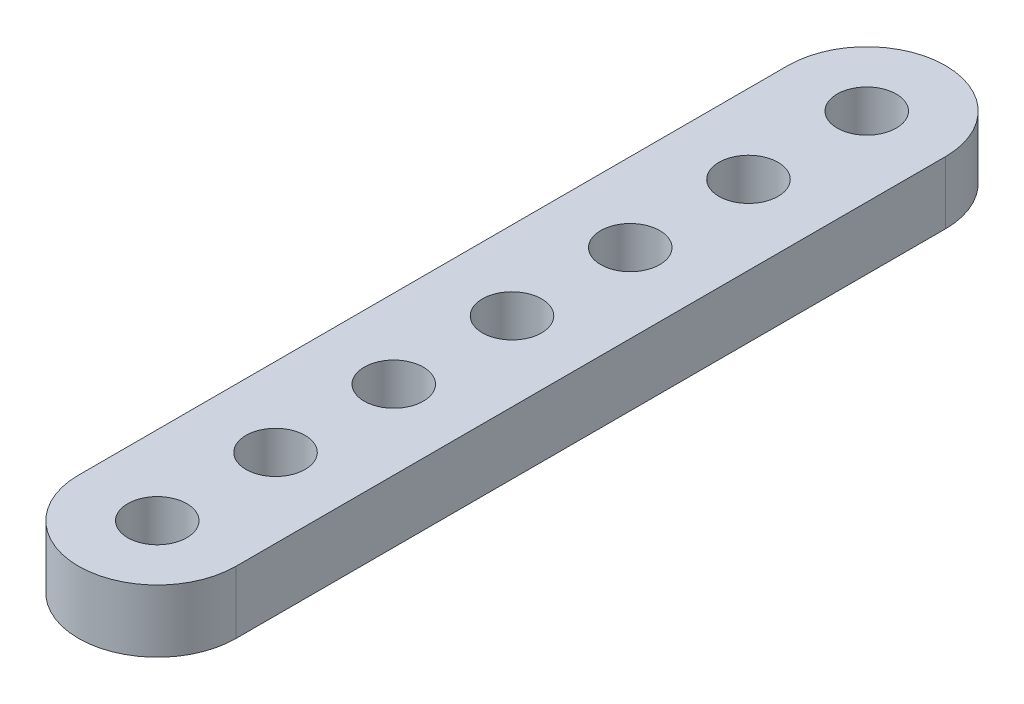
ISO-10303-21;
HEADER;
FILE_DESCRIPTION(('STEP AP214'),'2;1');
FILE_NAME('part.step','',(''),(''),'','','');
FILE_SCHEMA(('AUTOMOTIVE_DESIGN { 1 0 10303 214 1 1 1 1 }'));
ENDSEC;
DATA;
#1=APPLICATION_CONTEXT('core data for automotive mechanical design processes');
#2=APPLICATION_PROTOCOL_DEFINITION('international standard','automotive_design',2000,#1);
#3=PRODUCT_CONTEXT('',#1,'mechanical');
#4=PRODUCT('Part','Part','',(#3));
#5=PRODUCT_RELATED_PRODUCT_CATEGORY('part','',(#4));
#6=PRODUCT_DEFINITION_FORMATION('','',#4);
#7=PRODUCT_DEFINITION_CONTEXT('part definition',#1,'design');
#8=PRODUCT_DEFINITION('design','',#6,#7);
#9=PRODUCT_DEFINITION_SHAPE('','',#8);
#10=(LENGTH_UNIT() NAMED_UNIT(*) SI_UNIT(.MILLI.,.METRE.));
#11=(NAMED_UNIT(*) PLANE_ANGLE_UNIT() SI_UNIT($,.RADIAN.));
#12=(NAMED_UNIT(*) SI_UNIT($,.STERADIAN.) SOLID_ANGLE_UNIT());
#13=UNCERTAINTY_MEASURE_WITH_UNIT(LENGTH_MEASURE(1.E-05),#10,'distance_accuracy_value','');
#14=(GEOMETRIC_REPRESENTATION_CONTEXT(3) GLOBAL_UNCERTAINTY_ASSIGNED_CONTEXT((#13)) GLOBAL_UNIT_ASSIGNED_CONTEXT((#10,
#11,#12)) REPRESENTATION_CONTEXT('',''));
#15=CARTESIAN_POINT('',(0.,0.,0.));
#16=DIRECTION('',(0.,0.,1.));
#17=DIRECTION('',(1.,0.,0.));
#18=AXIS2_PLACEMENT_3D('',#15,#16,#17);
#19=CARTESIAN_POINT('',(4.,3.175,0.));
#20=DIRECTION('',(0.,1.,0.));
#21=DIRECTION('',(0.,0.,1.));
#22=AXIS2_PLACEMENT_3D('',#19,#20,#21);
#23=PLANE('',#22);
#24=CARTESIAN_POINT('',(3.9999999999999,3.175,-30.));
#25=DIRECTION('',(0.,1.,0.));
#26=DIRECTION('',(0.,0.,1.));
#27=AXIS2_PLACEMENT_3D('',#24,#25,#26);
#28=CIRCLE('',#27,1.5);
#29=CARTESIAN_POINT('',(3.9999999999999,3.175,-28.5));
#30=VERTEX_POINT('',#29);
#31=EDGE_CURVE('E141',#30,#30,#28,.T.);
#32=ORIENTED_EDGE('',*,*,#31,.F.);
#33=EDGE_LOOP('',(#32));
#34=FACE_BOUND('',#33,.T.);
#35=CARTESIAN_POINT('',(3.99999999999994,3.175,-18.));
#36=DIRECTION('',(0.,1.,0.));
#37=DIRECTION('',(0.,0.,1.));
#38=AXIS2_PLACEMENT_3D('',#35,#36,#37);
#39=CIRCLE('',#38,1.5);
#40=CARTESIAN_POINT('',(3.99999999999994,3.175,-16.5));
#41=VERTEX_POINT('',#40);
#42=EDGE_CURVE('E129',#41,#41,#39,.T.);
#43=ORIENTED_EDGE('',*,*,#42,.F.);
#44=EDGE_LOOP('',(#43));
#45=FACE_BOUND('',#44,.T.);
#46=CARTESIAN_POINT('',(3.99999999999998,3.175,-6.));
#47=DIRECTION('',(0.,1.,0.));
#48=DIRECTION('',(0.,0.,1.));
#49=AXIS2_PLACEMENT_3D('',#46,#47,#48);
#50=CIRCLE('',#49,1.5);
#51=CARTESIAN_POINT('',(3.99999999999998,3.175,-4.5));
#52=VERTEX_POINT('',#51);
#53=EDGE_CURVE('E117',#52,#52,#50,.T.);
#54=ORIENTED_EDGE('',*,*,#53,.F.);
#55=EDGE_LOOP('',(#54));
#56=FACE_BOUND('',#55,.T.);
#57=CARTESIAN_POINT('',(4.,3.175,0.));
#58=DIRECTION('',(0.,1.,0.));
#59=DIRECTION('',(0.,0.,1.));
#60=AXIS2_PLACEMENT_3D('',#57,#58,#59);
#61=CIRCLE('',#60,4.);
#62=CARTESIAN_POINT('',(0.,3.175,0.));
#63=VERTEX_POINT('',#62);
#64=CARTESIAN_POINT('',(8.,3.175,0.));
#65=VERTEX_POINT('',#64);
#66=EDGE_CURVE('E87',#63,#65,#61,.T.);
#67=ORIENTED_EDGE('',*,*,#66,.T.);
#68=DIRECTION('',(0.,0.,-1.));
#69=VECTOR('',#68,1.);
#70=CARTESIAN_POINT('',(8.,3.175,0.));
#71=LINE('',#70,#69);
#72=CARTESIAN_POINT('',(7.99999999999988,3.175,-36.));
#73=VERTEX_POINT('',#72);
#74=EDGE_CURVE('E82',#65,#73,#71,.T.);
#75=ORIENTED_EDGE('',*,*,#74,.T.);
#76=CARTESIAN_POINT('',(3.99999999999987,3.175,-36.));
#77=DIRECTION('',(0.,1.,0.));
#78=DIRECTION('',(0.,0.,1.));
#79=AXIS2_PLACEMENT_3D('',#76,#77,#78);
#80=CIRCLE('',#79,4.);
#81=CARTESIAN_POINT('',(0.,3.175,-36.));
#82=VERTEX_POINT('',#81);
#83=EDGE_CURVE('E85',#73,#82,#80,.T.);
#84=ORIENTED_EDGE('',*,*,#83,.T.);
#85=DIRECTION('',(0.,0.,1.));
#86=VECTOR('',#85,1.);
#87=CARTESIAN_POINT('',(0.,3.175,0.));
#88=LINE('',#87,#86);
#89=EDGE_CURVE('E52',#82,#63,#88,.T.);
#90=ORIENTED_EDGE('',*,*,#89,.T.);
#91=EDGE_LOOP('',(#67,#75,#84,#90));
#92=FACE_BOUND('',#91,.T.);
#93=CARTESIAN_POINT('',(4.,3.175,0.));
#94=DIRECTION('',(0.,1.,0.));
#95=DIRECTION('',(0.,0.,1.));
#96=AXIS2_PLACEMENT_3D('',#93,#94,#95);
#97=CIRCLE('',#96,1.5);
#98=CARTESIAN_POINT('',(4.,3.175,1.5));
#99=VERTEX_POINT('',#98);
#100=EDGE_CURVE('E102',#99,#99,#97,.T.);
#101=ORIENTED_EDGE('',*,*,#100,.F.);
#102=EDGE_LOOP('',(#101));
#103=FACE_BOUND('',#102,.T.);
#104=CARTESIAN_POINT('',(3.99999999999996,3.175,-12.));
#105=DIRECTION('',(0.,1.,0.));
#106=DIRECTION('',(0.,0.,1.));
#107=AXIS2_PLACEMENT_3D('',#104,#105,#106);
#108=CIRCLE('',#107,1.5);
#109=CARTESIAN_POINT('',(3.99999999999996,3.175,-10.5));
#110=VERTEX_POINT('',#109);
#111=EDGE_CURVE('E123',#110,#110,#108,.T.);
#112=ORIENTED_EDGE('',*,*,#111,.F.);
#113=EDGE_LOOP('',(#112));
#114=FACE_BOUND('',#113,.T.);
#115=CARTESIAN_POINT('',(3.99999999999992,3.175,-24.));
#116=DIRECTION('',(0.,1.,0.));
#117=DIRECTION('',(0.,0.,1.));
#118=AXIS2_PLACEMENT_3D('',#115,#116,#117);
#119=CIRCLE('',#118,1.5);
#120=CARTESIAN_POINT('',(3.99999999999992,3.175,-22.5));
#121=VERTEX_POINT('',#120);
#122=EDGE_CURVE('E135',#121,#121,#119,.T.);
#123=ORIENTED_EDGE('',*,*,#122,.F.);
#124=EDGE_LOOP('',(#123));
#125=FACE_BOUND('',#124,.T.);
#126=CARTESIAN_POINT('',(3.99999999999987,3.175,-36.));
#127=DIRECTION('',(0.,1.,0.));
#128=DIRECTION('',(0.,0.,1.));
#129=AXIS2_PLACEMENT_3D('',#126,#127,#128);
#130=CIRCLE('',#129,1.5);
#131=CARTESIAN_POINT('',(3.99999999999987,3.175,-34.5));
#132=VERTEX_POINT('',#131);
#133=EDGE_CURVE('E147',#132,#132,#130,.T.);
#134=ORIENTED_EDGE('',*,*,#133,.F.);
#135=EDGE_LOOP('',(#134));
#136=FACE_BOUND('',#135,.T.);
#137=ADVANCED_FACE('F35',(#34,#45,#56,#92,#103,#114,#125,#136),#23,.T.);
#138=CARTESIAN_POINT('',(4.,0.,0.));
#139=DIRECTION('',(0.,1.,0.));
#140=DIRECTION('',(0.,0.,1.));
#141=AXIS2_PLACEMENT_3D('',#138,#139,#140);
#142=PLANE('',#141);
#143=CARTESIAN_POINT('',(3.9999999999999,0.,-30.));
#144=DIRECTION('',(0.,1.,0.));
#145=DIRECTION('',(0.,0.,1.));
#146=AXIS2_PLACEMENT_3D('',#143,#144,#145);
#147=CIRCLE('',#146,1.5);
#148=CARTESIAN_POINT('',(3.9999999999999,0.,-28.5));
#149=VERTEX_POINT('',#148);
#150=EDGE_CURVE('E144',#149,#149,#147,.T.);
#151=ORIENTED_EDGE('',*,*,#150,.T.);
#152=EDGE_LOOP('',(#151));
#153=FACE_BOUND('',#152,.T.);
#154=CARTESIAN_POINT('',(3.99999999999994,0.,-18.));
#155=DIRECTION('',(0.,1.,0.));
#156=DIRECTION('',(0.,0.,1.));
#157=AXIS2_PLACEMENT_3D('',#154,#155,#156);
#158=CIRCLE('',#157,1.5);
#159=CARTESIAN_POINT('',(3.99999999999994,0.,-16.5));
#160=VERTEX_POINT('',#159);
#161=EDGE_CURVE('E132',#160,#160,#158,.T.);
#162=ORIENTED_EDGE('',*,*,#161,.T.);
#163=EDGE_LOOP('',(#162));
#164=FACE_BOUND('',#163,.T.);
#165=CARTESIAN_POINT('',(3.99999999999998,0.,-6.));
#166=DIRECTION('',(0.,1.,0.));
#167=DIRECTION('',(0.,0.,1.));
#168=AXIS2_PLACEMENT_3D('',#165,#166,#167);
#169=CIRCLE('',#168,1.5);
#170=CARTESIAN_POINT('',(3.99999999999998,0.,-4.5));
#171=VERTEX_POINT('',#170);
#172=EDGE_CURVE('E120',#171,#171,#169,.T.);
#173=ORIENTED_EDGE('',*,*,#172,.T.);
#174=EDGE_LOOP('',(#173));
#175=FACE_BOUND('',#174,.T.);
#176=CARTESIAN_POINT('',(4.,0.,0.));
#177=DIRECTION('',(0.,1.,0.));
#178=DIRECTION('',(0.,0.,1.));
#179=AXIS2_PLACEMENT_3D('',#176,#177,#178);
#180=CIRCLE('',#179,4.);
#181=CARTESIAN_POINT('',(0.,0.,0.));
#182=VERTEX_POINT('',#181);
#183=CARTESIAN_POINT('',(8.,0.,0.));
#184=VERTEX_POINT('',#183);
#185=EDGE_CURVE('E99',#182,#184,#180,.T.);
#186=ORIENTED_EDGE('',*,*,#185,.F.);
#187=DIRECTION('',(0.,0.,1.));
#188=VECTOR('',#187,1.);
#189=CARTESIAN_POINT('',(0.,0.,0.));
#190=LINE('',#189,#188);
#191=CARTESIAN_POINT('',(0.,0.,-36.));
#192=VERTEX_POINT('',#191);
#193=EDGE_CURVE('E75',#192,#182,#190,.T.);
#194=ORIENTED_EDGE('',*,*,#193,.F.);
#195=CARTESIAN_POINT('',(3.99999999999987,0.,-36.));
#196=DIRECTION('',(0.,1.,0.));
#197=DIRECTION('',(0.,0.,1.));
#198=AXIS2_PLACEMENT_3D('',#195,#196,#197);
#199=CIRCLE('',#198,4.);
#200=CARTESIAN_POINT('',(7.99999999999988,0.,-36.));
#201=VERTEX_POINT('',#200);
#202=EDGE_CURVE('E69',#201,#192,#199,.T.);
#203=ORIENTED_EDGE('',*,*,#202,.F.);
#204=DIRECTION('',(0.,0.,-1.));
#205=VECTOR('',#204,1.);
#206=CARTESIAN_POINT('',(8.,0.,0.));
#207=LINE('',#206,#205);
#208=EDGE_CURVE('E91',#184,#201,#207,.T.);
#209=ORIENTED_EDGE('',*,*,#208,.F.);
#210=EDGE_LOOP('',(#186,#194,#203,#209));
#211=FACE_BOUND('',#210,.T.);
#212=CARTESIAN_POINT('',(4.,0.,0.));
#213=DIRECTION('',(0.,1.,0.));
#214=DIRECTION('',(0.,0.,1.));
#215=AXIS2_PLACEMENT_3D('',#212,#213,#214);
#216=CIRCLE('',#215,1.5);
#217=CARTESIAN_POINT('',(4.,0.,1.5));
#218=VERTEX_POINT('',#217);
#219=EDGE_CURVE('E114',#218,#218,#216,.T.);
#220=ORIENTED_EDGE('',*,*,#219,.T.);
#221=EDGE_LOOP('',(#220));
#222=FACE_BOUND('',#221,.T.);
#223=CARTESIAN_POINT('',(3.99999999999996,0.,-12.));
#224=DIRECTION('',(0.,1.,0.));
#225=DIRECTION('',(0.,0.,1.));
#226=AXIS2_PLACEMENT_3D('',#223,#224,#225);
#227=CIRCLE('',#226,1.5);
#228=CARTESIAN_POINT('',(3.99999999999996,0.,-10.5));
#229=VERTEX_POINT('',#228);
#230=EDGE_CURVE('E126',#229,#229,#227,.T.);
#231=ORIENTED_EDGE('',*,*,#230,.T.);
#232=EDGE_LOOP('',(#231));
#233=FACE_BOUND('',#232,.T.);
#234=CARTESIAN_POINT('',(3.99999999999992,0.,-24.));
#235=DIRECTION('',(0.,1.,0.));
#236=DIRECTION('',(0.,0.,1.));
#237=AXIS2_PLACEMENT_3D('',#234,#235,#236);
#238=CIRCLE('',#237,1.5);
#239=CARTESIAN_POINT('',(3.99999999999992,0.,-22.5));
#240=VERTEX_POINT('',#239);
#241=EDGE_CURVE('E138',#240,#240,#238,.T.);
#242=ORIENTED_EDGE('',*,*,#241,.T.);
#243=EDGE_LOOP('',(#242));
#244=FACE_BOUND('',#243,.T.);
#245=CARTESIAN_POINT('',(3.99999999999987,0.,-36.));
#246=DIRECTION('',(0.,1.,0.));
#247=DIRECTION('',(0.,0.,1.));
#248=AXIS2_PLACEMENT_3D('',#245,#246,#247);
#249=CIRCLE('',#248,1.5);
#250=CARTESIAN_POINT('',(3.99999999999987,0.,-34.5));
#251=VERTEX_POINT('',#250);
#252=EDGE_CURVE('E150',#251,#251,#249,.T.);
#253=ORIENTED_EDGE('',*,*,#252,.T.);
#254=EDGE_LOOP('',(#253));
#255=FACE_BOUND('',#254,.T.);
#256=ADVANCED_FACE('F110',(#153,#164,#175,#211,#222,#233,#244,#255),#142,.F.);
#257=CARTESIAN_POINT('',(4.,3.175,0.));
#258=DIRECTION('',(0.,-1.,0.));
#259=DIRECTION('',(0.,0.,-1.));
#260=AXIS2_PLACEMENT_3D('',#257,#258,#259);
#261=CYLINDRICAL_SURFACE('',#260,4.);
#262=ORIENTED_EDGE('',*,*,#185,.T.);
#263=DIRECTION('',(0.,-1.,0.));
#264=VECTOR('',#263,1.);
#265=CARTESIAN_POINT('',(8.,3.175,0.));
#266=LINE('',#265,#264);
#267=EDGE_CURVE('E11',#65,#184,#266,.T.);
#268=ORIENTED_EDGE('',*,*,#267,.F.);
#269=ORIENTED_EDGE('',*,*,#66,.F.);
#270=DIRECTION('',(0.,-1.,0.));
#271=VECTOR('',#270,1.);
#272=CARTESIAN_POINT('',(0.,3.175,0.));
#273=LINE('',#272,#271);
#274=EDGE_CURVE('E95',#63,#182,#273,.T.);
#275=ORIENTED_EDGE('',*,*,#274,.T.);
#276=EDGE_LOOP('',(#262,#268,#269,#275));
#277=FACE_BOUND('',#276,.T.);
#278=ADVANCED_FACE('F37',(#277),#261,.T.);
#279=CARTESIAN_POINT('',(8.,3.175,0.));
#280=DIRECTION('',(-1.,0.,0.));
#281=DIRECTION('',(0.,0.,1.));
#282=AXIS2_PLACEMENT_3D('',#279,#280,#281);
#283=PLANE('',#282);
#284=ORIENTED_EDGE('',*,*,#208,.T.);
#285=DIRECTION('',(0.,-1.,0.));
#286=VECTOR('',#285,1.);
#287=CARTESIAN_POINT('',(7.99999999999988,3.175,-36.));
#288=LINE('',#287,#286);
#289=EDGE_CURVE('E44',#73,#201,#288,.T.);
#290=ORIENTED_EDGE('',*,*,#289,.F.);
#291=ORIENTED_EDGE('',*,*,#74,.F.);
#292=ORIENTED_EDGE('',*,*,#267,.T.);
#293=EDGE_LOOP('',(#284,#290,#291,#292));
#294=FACE_BOUND('',#293,.T.);
#295=ADVANCED_FACE('F90',(#294),#283,.F.);
#296=CARTESIAN_POINT('',(3.99999999999987,3.175,-36.));
#297=DIRECTION('',(0.,-1.,0.));
#298=DIRECTION('',(0.,0.,-1.));
#299=AXIS2_PLACEMENT_3D('',#296,#297,#298);
#300=CYLINDRICAL_SURFACE('',#299,4.);
#301=ORIENTED_EDGE('',*,*,#202,.T.);
#302=DIRECTION('',(0.,-1.,0.));
#303=VECTOR('',#302,1.);
#304=CARTESIAN_POINT('',(0.,3.175,-36.));
#305=LINE('',#304,#303);
#306=EDGE_CURVE('E92',#82,#192,#305,.T.);
#307=ORIENTED_EDGE('',*,*,#306,.F.);
#308=ORIENTED_EDGE('',*,*,#83,.F.);
#309=ORIENTED_EDGE('',*,*,#289,.T.);
#310=EDGE_LOOP('',(#301,#307,#308,#309));
#311=FACE_BOUND('',#310,.T.);
#312=ADVANCED_FACE('F93',(#311),#300,.T.);
#313=CARTESIAN_POINT('',(0.,3.175,0.));
#314=DIRECTION('',(1.,0.,0.));
#315=DIRECTION('',(0.,0.,-1.));
#316=AXIS2_PLACEMENT_3D('',#313,#314,#315);
#317=PLANE('',#316);
#318=ORIENTED_EDGE('',*,*,#193,.T.);
#319=ORIENTED_EDGE('',*,*,#274,.F.);
#320=ORIENTED_EDGE('',*,*,#89,.F.);
#321=ORIENTED_EDGE('',*,*,#306,.T.);
#322=EDGE_LOOP('',(#318,#319,#320,#321));
#323=FACE_BOUND('',#322,.T.);
#324=ADVANCED_FACE('F107',(#323),#317,.F.);
#325=CARTESIAN_POINT('',(4.,3.175,0.));
#326=DIRECTION('',(0.,-1.,0.));
#327=DIRECTION('',(0.,0.,-1.));
#328=AXIS2_PLACEMENT_3D('',#325,#326,#327);
#329=CYLINDRICAL_SURFACE('',#328,1.5);
#330=ORIENTED_EDGE('',*,*,#100,.T.);
#331=EDGE_LOOP('',(#330));
#332=FACE_BOUND('',#331,.T.);
#333=ORIENTED_EDGE('',*,*,#219,.F.);
#334=EDGE_LOOP('',(#333));
#335=FACE_BOUND('',#334,.T.);
#336=ADVANCED_FACE('F170',(#332,#335),#329,.F.);
#337=CARTESIAN_POINT('',(3.99999999999998,3.175,-6.));
#338=DIRECTION('',(0.,-1.,0.));
#339=DIRECTION('',(0.,0.,-1.));
#340=AXIS2_PLACEMENT_3D('',#337,#338,#339);
#341=CYLINDRICAL_SURFACE('',#340,1.5);
#342=ORIENTED_EDGE('',*,*,#53,.T.);
#343=EDGE_LOOP('',(#342));
#344=FACE_BOUND('',#343,.T.);
#345=ORIENTED_EDGE('',*,*,#172,.F.);
#346=EDGE_LOOP('',(#345));
#347=FACE_BOUND('',#346,.T.);
#348=ADVANCED_FACE('F216',(#344,#347),#341,.F.);
#349=CARTESIAN_POINT('',(3.99999999999996,3.175,-12.));
#350=DIRECTION('',(0.,-1.,0.));
#351=DIRECTION('',(0.,0.,-1.));
#352=AXIS2_PLACEMENT_3D('',#349,#350,#351);
#353=CYLINDRICAL_SURFACE('',#352,1.5);
#354=ORIENTED_EDGE('',*,*,#111,.T.);
#355=EDGE_LOOP('',(#354));
#356=FACE_BOUND('',#355,.T.);
#357=ORIENTED_EDGE('',*,*,#230,.F.);
#358=EDGE_LOOP('',(#357));
#359=FACE_BOUND('',#358,.T.);
#360=ADVANCED_FACE('F224',(#356,#359),#353,.F.);
#361=CARTESIAN_POINT('',(3.99999999999994,3.175,-18.));
#362=DIRECTION('',(0.,-1.,0.));
#363=DIRECTION('',(0.,0.,-1.));
#364=AXIS2_PLACEMENT_3D('',#361,#362,#363);
#365=CYLINDRICAL_SURFACE('',#364,1.5);
#366=ORIENTED_EDGE('',*,*,#42,.T.);
#367=EDGE_LOOP('',(#366));
#368=FACE_BOUND('',#367,.T.);
#369=ORIENTED_EDGE('',*,*,#161,.F.);
#370=EDGE_LOOP('',(#369));
#371=FACE_BOUND('',#370,.T.);
#372=ADVANCED_FACE('F232',(#368,#371),#365,.F.);
#373=CARTESIAN_POINT('',(3.99999999999992,3.175,-24.));
#374=DIRECTION('',(0.,-1.,0.));
#375=DIRECTION('',(0.,0.,-1.));
#376=AXIS2_PLACEMENT_3D('',#373,#374,#375);
#377=CYLINDRICAL_SURFACE('',#376,1.5);
#378=ORIENTED_EDGE('',*,*,#122,.T.);
#379=EDGE_LOOP('',(#378));
#380=FACE_BOUND('',#379,.T.);
#381=ORIENTED_EDGE('',*,*,#241,.F.);
#382=EDGE_LOOP('',(#381));
#383=FACE_BOUND('',#382,.T.);
#384=ADVANCED_FACE('F241',(#380,#383),#377,.F.);
#385=CARTESIAN_POINT('',(3.9999999999999,3.175,-30.));
#386=DIRECTION('',(0.,-1.,0.));
#387=DIRECTION('',(0.,0.,-1.));
#388=AXIS2_PLACEMENT_3D('',#385,#386,#387);
#389=CYLINDRICAL_SURFACE('',#388,1.5);
#390=ORIENTED_EDGE('',*,*,#31,.T.);
#391=EDGE_LOOP('',(#390));
#392=FACE_BOUND('',#391,.T.);
#393=ORIENTED_EDGE('',*,*,#150,.F.);
#394=EDGE_LOOP('',(#393));
#395=FACE_BOUND('',#394,.T.);
#396=ADVANCED_FACE('F250',(#392,#395),#389,.F.);
#397=CARTESIAN_POINT('',(3.99999999999987,3.175,-36.));
#398=DIRECTION('',(0.,-1.,0.));
#399=DIRECTION('',(0.,0.,-1.));
#400=AXIS2_PLACEMENT_3D('',#397,#398,#399);
#401=CYLINDRICAL_SURFACE('',#400,1.5);
#402=ORIENTED_EDGE('',*,*,#133,.T.);
#403=EDGE_LOOP('',(#402));
#404=FACE_BOUND('',#403,.T.);
#405=ORIENTED_EDGE('',*,*,#252,.F.);
#406=EDGE_LOOP('',(#405));
#407=FACE_BOUND('',#406,.T.);
#408=ADVANCED_FACE('F156',(#404,#407),#401,.F.);
#409=CLOSED_SHELL('',(#137,#256,#278,#295,#312,#324,#336,#348,#360,#372,#384,#396,#408));
#410=MANIFOLD_SOLID_BREP('B2',#409);
#411=ADVANCED_BREP_SHAPE_REPRESENTATION('',(#18,#410),#14);
#412=SHAPE_DEFINITION_REPRESENTATION(#9,#411);
ENDSEC;
END-ISO-10303-21;
